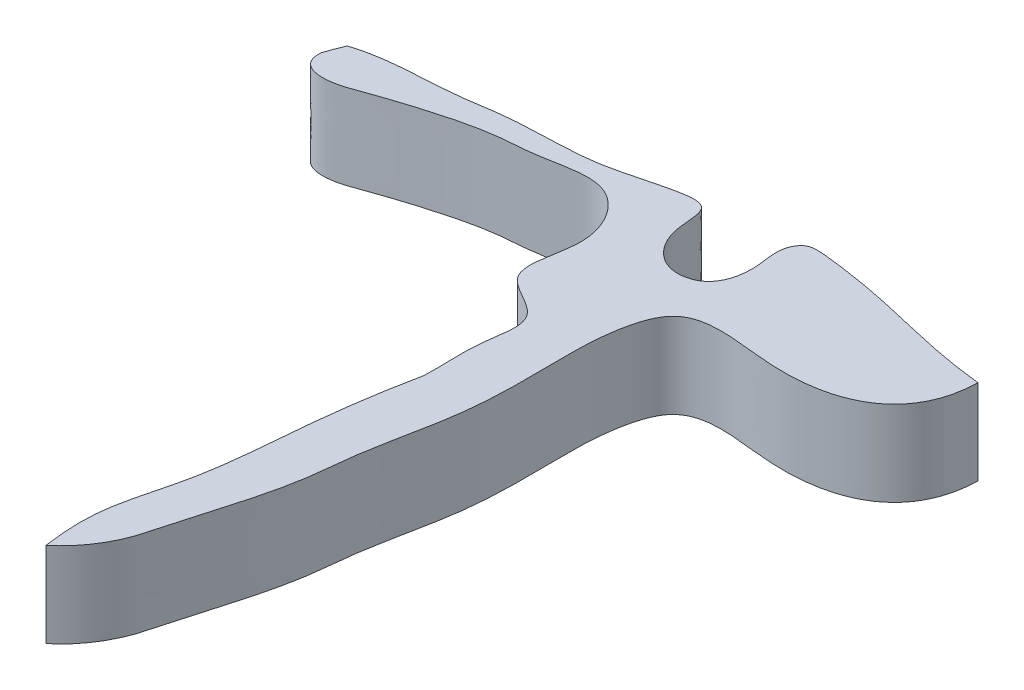
ISO-10303-21;
HEADER;
FILE_DESCRIPTION(('STEP AP214'),'2;1');
FILE_NAME('part.step','',(''),(''),'','','');
FILE_SCHEMA(('AUTOMOTIVE_DESIGN { 1 0 10303 214 1 1 1 1 }'));
ENDSEC;
DATA;
#1=APPLICATION_CONTEXT('core data for automotive mechanical design processes');
#2=APPLICATION_PROTOCOL_DEFINITION('international standard','automotive_design',2000,#1);
#3=PRODUCT_CONTEXT('',#1,'mechanical');
#4=PRODUCT('Part','Part','',(#3));
#5=PRODUCT_RELATED_PRODUCT_CATEGORY('part','',(#4));
#6=PRODUCT_DEFINITION_FORMATION('','',#4);
#7=PRODUCT_DEFINITION_CONTEXT('part definition',#1,'design');
#8=PRODUCT_DEFINITION('design','',#6,#7);
#9=PRODUCT_DEFINITION_SHAPE('','',#8);
#10=(LENGTH_UNIT() NAMED_UNIT(*) SI_UNIT(.MILLI.,.METRE.));
#11=(NAMED_UNIT(*) PLANE_ANGLE_UNIT() SI_UNIT($,.RADIAN.));
#12=(NAMED_UNIT(*) SI_UNIT($,.STERADIAN.) SOLID_ANGLE_UNIT());
#13=UNCERTAINTY_MEASURE_WITH_UNIT(LENGTH_MEASURE(1.E-05),#10,'distance_accuracy_value','');
#14=(GEOMETRIC_REPRESENTATION_CONTEXT(3) GLOBAL_UNCERTAINTY_ASSIGNED_CONTEXT((#13)) GLOBAL_UNIT_ASSIGNED_CONTEXT((#10,
#11,#12)) REPRESENTATION_CONTEXT('',''));
#15=CARTESIAN_POINT('',(0.,0.,0.));
#16=DIRECTION('',(0.,0.,1.));
#17=DIRECTION('',(1.,0.,0.));
#18=AXIS2_PLACEMENT_3D('',#15,#16,#17);
#19=CARTESIAN_POINT('',(24.0375140392618,15.,-145.517039337161));
#20=CARTESIAN_POINT('',(24.2621933412284,15.,-143.639002282934));
#21=CARTESIAN_POINT('',(25.4171269550409,15.,-138.134761259731));
#22=CARTESIAN_POINT('',(30.007706348826,15.,-128.35761833204));
#23=CARTESIAN_POINT('',(39.7991492205917,15.,-121.115164183697));
#24=CARTESIAN_POINT('',(43.2128797081711,15.,-110.146291015422));
#25=CARTESIAN_POINT('',(48.6550116352046,15.,-97.0573730260903));
#26=CARTESIAN_POINT('',(49.9672872180633,15.,-86.7279437435889));
#27=CARTESIAN_POINT('',(54.645986214799,15.,-75.4111400507352));
#28=CARTESIAN_POINT('',(57.5935042038401,15.,-57.5488206758712));
#29=CARTESIAN_POINT('',(72.3520359826397,15.,-47.8515999679621));
#30=CARTESIAN_POINT('',(69.1403617110828,15.,-35.8249751369739));
#31=CARTESIAN_POINT('',(82.723997719919,15.,-21.3135393408815));
#32=CARTESIAN_POINT('',(91.4610009765337,15.,-26.0845568898553));
#33=CARTESIAN_POINT('',(99.3599729309818,15.,-34.1459829190389));
#34=CARTESIAN_POINT('',(106.459091673804,15.,-48.0552498706429));
#35=CARTESIAN_POINT('',(101.533602131844,15.,-62.2604950775486));
#36=CARTESIAN_POINT('',(98.8404018994914,15.,-74.4775870626433));
#37=CARTESIAN_POINT('',(96.868182285158,15.,-87.5543523438555));
#38=CARTESIAN_POINT('',(101.802241124934,15.,-102.14324591199));
#39=CARTESIAN_POINT('',(102.790355638582,15.,-119.297508142271));
#40=CARTESIAN_POINT('',(104.336005258598,15.,-130.446896525842));
#41=CARTESIAN_POINT('',(105.753591562007,15.,-137.401839946369));
#42=CARTESIAN_POINT('',(105.757273732984,15.,-137.419894275042));
#43=B_SPLINE_CURVE_WITH_KNOTS('',3,(#19,#20,#21,#22,#23,#24,#25,#26,#27,#28,#29,#30,#31,#32,#33,
#34,#35,#36,#37,#38,#39,#40,#41,#42),.UNSPECIFIED.,.F.,.F.,(4,1,1,1,1,1,1,1,1,1,1,1,1,1,1,1,1,1,
1,1,1,4),(0.0848827910846383,0.107769947600504,0.154078141193935,0.187829052452645,
0.232552432956342,0.26970929217058,0.335228905495779,0.34759696703288,0.388301803040621,
0.400297277197863,0.462463604104336,0.490432200988639,0.503110695907215,0.523547211958244,
0.568461378057781,0.596541231678332,0.621395322375599,0.653634391335673,0.683152646319912,
0.723780599049945,0.766209008009937,0.766319387221955),.UNSPECIFIED.);
#44=DIRECTION('',(0.,-1.,0.));
#45=VECTOR('',#44,1.);
#46=SURFACE_OF_LINEAR_EXTRUSION('',#43,#45);
#47=CARTESIAN_POINT('',(24.0375140392618,0.,-145.517039337161));
#48=CARTESIAN_POINT('',(24.2621933412284,0.,-143.639002282934));
#49=CARTESIAN_POINT('',(25.4171269550409,0.,-138.134761259731));
#50=CARTESIAN_POINT('',(30.007706348826,0.,-128.35761833204));
#51=CARTESIAN_POINT('',(39.7991492205917,0.,-121.115164183697));
#52=CARTESIAN_POINT('',(43.2128797081711,0.,-110.146291015422));
#53=CARTESIAN_POINT('',(48.6550116352046,0.,-97.0573730260903));
#54=CARTESIAN_POINT('',(49.9672872180633,0.,-86.7279437435889));
#55=CARTESIAN_POINT('',(54.645986214799,0.,-75.4111400507352));
#56=CARTESIAN_POINT('',(57.5935042038401,0.,-57.5488206758712));
#57=CARTESIAN_POINT('',(72.3520359826397,0.,-47.8515999679621));
#58=CARTESIAN_POINT('',(69.1403617110828,0.,-35.8249751369739));
#59=CARTESIAN_POINT('',(82.723997719919,0.,-21.3135393408815));
#60=CARTESIAN_POINT('',(91.4610009765337,0.,-26.0845568898553));
#61=CARTESIAN_POINT('',(99.3599729309818,0.,-34.1459829190389));
#62=CARTESIAN_POINT('',(106.459091673804,0.,-48.0552498706429));
#63=CARTESIAN_POINT('',(101.533602131844,0.,-62.2604950775486));
#64=CARTESIAN_POINT('',(98.8404018994914,0.,-74.4775870626433));
#65=CARTESIAN_POINT('',(96.868182285158,0.,-87.5543523438555));
#66=CARTESIAN_POINT('',(101.802241124934,0.,-102.14324591199));
#67=CARTESIAN_POINT('',(102.790355638582,0.,-119.297508142271));
#68=CARTESIAN_POINT('',(104.336005258598,0.,-130.446896525842));
#69=CARTESIAN_POINT('',(105.753591562007,0.,-137.401839946369));
#70=CARTESIAN_POINT('',(105.757273732984,0.,-137.419894275042));
#71=B_SPLINE_CURVE_WITH_KNOTS('',3,(#47,#48,#49,#50,#51,#52,#53,#54,#55,#56,#57,#58,#59,#60,#61,
#62,#63,#64,#65,#66,#67,#68,#69,#70),.UNSPECIFIED.,.F.,.F.,(4,1,1,1,1,1,1,1,1,1,1,1,1,1,1,1,1,1,
1,1,1,4),(0.0848827910846383,0.107769947600504,0.154078141193935,0.187829052452645,
0.232552432956342,0.26970929217058,0.335228905495779,0.34759696703288,0.388301803040621,
0.400297277197863,0.462463604104336,0.490432200988639,0.503110695907215,0.523547211958244,
0.568461378057781,0.596541231678332,0.621395322375599,0.653634391335673,0.683152646319912,
0.723780599049945,0.766209008009937,0.766319387221955),.UNSPECIFIED.);
#72=CARTESIAN_POINT('',(98.3711739112684,0.,-78.2317084362458));
#73=VERTEX_POINT('',#72);
#74=CARTESIAN_POINT('',(105.757273732984,0.,-137.419894275042));
#75=VERTEX_POINT('',#74);
#76=EDGE_CURVE('E167',#73,#75,#71,.T.);
#77=ORIENTED_EDGE('',*,*,#76,.F.);
#78=DIRECTION('',(0.,-1.,0.));
#79=VECTOR('',#78,1.);
#80=CARTESIAN_POINT('',(98.3711739112684,15.,-78.2317084362458));
#81=LINE('',#80,#79);
#82=CARTESIAN_POINT('',(98.3711739112684,15.,-78.2317084362458));
#83=VERTEX_POINT('',#82);
#84=EDGE_CURVE('E11',#83,#73,#81,.T.);
#85=ORIENTED_EDGE('',*,*,#84,.F.);
#86=CARTESIAN_POINT('',(105.757273732984,15.,-137.419894275042));
#87=VERTEX_POINT('',#86);
#88=EDGE_CURVE('E137',#83,#87,#43,.T.);
#89=ORIENTED_EDGE('',*,*,#88,.T.);
#90=DIRECTION('',(0.,-1.,0.));
#91=VECTOR('',#90,1.);
#92=CARTESIAN_POINT('',(105.757273732984,15.,-137.419894275042));
#93=LINE('',#92,#91);
#94=EDGE_CURVE('E80',#87,#75,#93,.T.);
#95=ORIENTED_EDGE('',*,*,#94,.T.);
#96=EDGE_LOOP('',(#77,#85,#89,#95));
#97=FACE_BOUND('',#96,.T.);
#98=ADVANCED_FACE('F38',(#97),#46,.T.);
#99=CARTESIAN_POINT('',(155.713820159323,15.,-185.222032492138));
#100=CARTESIAN_POINT('',(155.425874834643,15.,-173.100712352762));
#101=CARTESIAN_POINT('',(140.483266869337,15.,-166.904105138324));
#102=CARTESIAN_POINT('',(118.936964382744,15.,-172.612470356245));
#103=CARTESIAN_POINT('',(115.192644125411,15.,-160.330308288356));
#104=CARTESIAN_POINT('',(115.348268100144,15.,-149.617652951586));
#105=CARTESIAN_POINT('',(115.444629092176,15.,-134.450964327299));
#106=CARTESIAN_POINT('',(112.04537119914,15.,-122.272000915312));
#107=CARTESIAN_POINT('',(110.825170090525,15.,-106.919954458305));
#108=CARTESIAN_POINT('',(107.256011136673,15.,-97.098479499063));
#109=CARTESIAN_POINT('',(104.287209349977,15.,-85.0571247463461));
#110=CARTESIAN_POINT('',(101.32680142316,15.,-80.6207119310641));
#111=CARTESIAN_POINT('',(98.3711739112684,15.,-78.2317084362458));
#112=B_SPLINE_CURVE_WITH_KNOTS('',3,(#99,#100,#101,#102,#103,#104,#105,#106,#107,#108,#109,#110,
#111),.UNSPECIFIED.,.F.,.F.,(4,1,1,1,1,1,1,1,1,1,4),(0.,0.208504742655187,0.326502314040696,
0.372956542354601,0.455666882521752,0.565002652878199,0.694719851294561,0.729433596082807,
0.891839378018672,0.917522652910268,1.),.UNSPECIFIED.);
#113=DIRECTION('',(0.,-1.,0.));
#114=VECTOR('',#113,1.);
#115=SURFACE_OF_LINEAR_EXTRUSION('',#112,#114);
#116=CARTESIAN_POINT('',(155.713820159323,0.,-185.222032492138));
#117=CARTESIAN_POINT('',(155.425874834643,0.,-173.100712352762));
#118=CARTESIAN_POINT('',(140.483266869337,0.,-166.904105138324));
#119=CARTESIAN_POINT('',(118.936964382744,0.,-172.612470356245));
#120=CARTESIAN_POINT('',(115.192644125411,0.,-160.330308288356));
#121=CARTESIAN_POINT('',(115.348268100144,0.,-149.617652951586));
#122=CARTESIAN_POINT('',(115.444629092176,0.,-134.450964327299));
#123=CARTESIAN_POINT('',(112.04537119914,0.,-122.272000915312));
#124=CARTESIAN_POINT('',(110.825170090525,0.,-106.919954458305));
#125=CARTESIAN_POINT('',(107.256011136673,0.,-97.098479499063));
#126=CARTESIAN_POINT('',(104.287209349977,0.,-85.0571247463461));
#127=CARTESIAN_POINT('',(101.32680142316,0.,-80.6207119310641));
#128=CARTESIAN_POINT('',(98.3711739112684,0.,-78.2317084362458));
#129=B_SPLINE_CURVE_WITH_KNOTS('',3,(#116,#117,#118,#119,#120,#121,#122,#123,#124,#125,#126,
#127,#128),.UNSPECIFIED.,.F.,.F.,(4,1,1,1,1,1,1,1,1,1,4),(0.,0.208504742655187,
0.326502314040696,0.372956542354601,0.455666882521752,0.565002652878199,0.694719851294561,
0.729433596082807,0.891839378018672,0.917522652910268,1.),.UNSPECIFIED.);
#130=CARTESIAN_POINT('',(155.713820159323,0.,-185.222032492138));
#131=VERTEX_POINT('',#130);
#132=EDGE_CURVE('E166',#131,#73,#129,.T.);
#133=ORIENTED_EDGE('',*,*,#132,.F.);
#134=DIRECTION('',(0.,-1.,0.));
#135=VECTOR('',#134,1.);
#136=CARTESIAN_POINT('',(155.713820159323,15.,-185.222032492138));
#137=LINE('',#136,#135);
#138=CARTESIAN_POINT('',(155.713820159323,15.,-185.222032492138));
#139=VERTEX_POINT('',#138);
#140=EDGE_CURVE('E47',#139,#131,#137,.T.);
#141=ORIENTED_EDGE('',*,*,#140,.F.);
#142=EDGE_CURVE('E95',#139,#83,#112,.T.);
#143=ORIENTED_EDGE('',*,*,#142,.T.);
#144=ORIENTED_EDGE('',*,*,#84,.T.);
#145=EDGE_LOOP('',(#133,#141,#143,#144));
#146=FACE_BOUND('',#145,.T.);
#147=ADVANCED_FACE('F131',(#146),#115,.T.);
#148=CARTESIAN_POINT('',(155.713820159323,15.,-185.222032492138));
#149=CARTESIAN_POINT('',(143.342435392716,15.,-186.514221571278));
#150=CARTESIAN_POINT('',(135.762881066941,15.,-190.123760484308));
#151=CARTESIAN_POINT('',(119.677410663172,15.,-191.492652460932));
#152=CARTESIAN_POINT('',(117.384240857628,15.,-188.118088909831));
#153=CARTESIAN_POINT('',(119.1020728407,15.,-183.057235226769));
#154=CARTESIAN_POINT('',(117.469060760467,15.,-176.157823140812));
#155=CARTESIAN_POINT('',(109.760824825789,15.,-174.578358031776));
#156=CARTESIAN_POINT('',(104.924855368414,15.,-180.553269248962));
#157=CARTESIAN_POINT('',(105.843805349473,15.,-189.040101481163));
#158=CARTESIAN_POINT('',(96.5318342952918,15.,-187.289596050032));
#159=CARTESIAN_POINT('',(86.9832692282938,15.,-184.161983924572));
#160=CARTESIAN_POINT('',(76.6059167192022,15.,-184.931536335817));
#161=CARTESIAN_POINT('',(62.09670727668,15.,-182.363322147543));
#162=CARTESIAN_POINT('',(54.5278983029869,15.,-182.998481509053));
#163=CARTESIAN_POINT('',(48.685902450927,15.,-181.03033137615));
#164=B_SPLINE_CURVE_WITH_KNOTS('',3,(#148,#149,#150,#151,#152,#153,#154,#155,#156,#157,#158,
#159,#160,#161,#162,#163),.UNSPECIFIED.,.F.,.F.,(4,1,1,1,1,1,1,1,1,1,1,1,1,4),(0.,
0.237104515152352,0.256899286666623,0.27101214660108,0.314512838874298,0.364494543262463,
0.396714068246079,0.458476347192645,0.498896481261305,0.536121657470359,0.613435160449401,
0.730760523837935,0.758905068892622,0.894880610996271),.UNSPECIFIED.);
#165=DIRECTION('',(0.,-1.,0.));
#166=VECTOR('',#165,1.);
#167=SURFACE_OF_LINEAR_EXTRUSION('',#164,#166);
#168=CARTESIAN_POINT('',(155.713820159323,0.,-185.222032492138));
#169=CARTESIAN_POINT('',(143.342435392716,0.,-186.514221571278));
#170=CARTESIAN_POINT('',(135.762881066941,0.,-190.123760484308));
#171=CARTESIAN_POINT('',(119.677410663172,0.,-191.492652460932));
#172=CARTESIAN_POINT('',(117.384240857628,0.,-188.118088909831));
#173=CARTESIAN_POINT('',(119.1020728407,0.,-183.057235226769));
#174=CARTESIAN_POINT('',(117.469060760467,0.,-176.157823140812));
#175=CARTESIAN_POINT('',(109.760824825789,0.,-174.578358031776));
#176=CARTESIAN_POINT('',(104.924855368414,0.,-180.553269248962));
#177=CARTESIAN_POINT('',(105.843805349473,0.,-189.040101481163));
#178=CARTESIAN_POINT('',(96.5318342952918,0.,-187.289596050032));
#179=CARTESIAN_POINT('',(86.9832692282938,0.,-184.161983924572));
#180=CARTESIAN_POINT('',(76.6059167192022,0.,-184.931536335817));
#181=CARTESIAN_POINT('',(62.09670727668,0.,-182.363322147543));
#182=CARTESIAN_POINT('',(54.5278983029869,0.,-182.998481509053));
#183=CARTESIAN_POINT('',(48.685902450927,0.,-181.03033137615));
#184=B_SPLINE_CURVE_WITH_KNOTS('',3,(#168,#169,#170,#171,#172,#173,#174,#175,#176,#177,#178,
#179,#180,#181,#182,#183),.UNSPECIFIED.,.F.,.F.,(4,1,1,1,1,1,1,1,1,1,1,1,1,4),(0.,
0.237104515152352,0.256899286666623,0.27101214660108,0.314512838874298,0.364494543262463,
0.396714068246079,0.458476347192645,0.498896481261305,0.536121657470359,0.613435160449401,
0.730760523837935,0.758905068892622,0.894880610996271),.UNSPECIFIED.);
#185=CARTESIAN_POINT('',(48.685902450927,0.,-181.03033137615));
#186=VERTEX_POINT('',#185);
#187=EDGE_CURVE('E102',#131,#186,#184,.T.);
#188=ORIENTED_EDGE('',*,*,#187,.T.);
#189=DIRECTION('',(0.,-1.,0.));
#190=VECTOR('',#189,1.);
#191=CARTESIAN_POINT('',(48.685902450927,15.,-181.03033137615));
#192=LINE('',#191,#190);
#193=CARTESIAN_POINT('',(48.685902450927,15.,-181.03033137615));
#194=VERTEX_POINT('',#193);
#195=EDGE_CURVE('E99',#194,#186,#192,.T.);
#196=ORIENTED_EDGE('',*,*,#195,.F.);
#197=EDGE_CURVE('E89',#139,#194,#164,.T.);
#198=ORIENTED_EDGE('',*,*,#197,.F.);
#199=ORIENTED_EDGE('',*,*,#140,.T.);
#200=EDGE_LOOP('',(#188,#196,#198,#199));
#201=FACE_BOUND('',#200,.T.);
#202=ADVANCED_FACE('F100',(#201),#167,.F.);
#203=CARTESIAN_POINT('',(46.5719716406135,15.,-170.254393226502));
#204=CARTESIAN_POINT('',(45.9125632375146,15.,-174.769031776489));
#205=CARTESIAN_POINT('',(48.685902450927,15.,-181.03033137615));
#206=B_SPLINE_CURVE_WITH_KNOTS('',2,(#203,#204,#205),.UNSPECIFIED.,.F.,.F.,(3,3),
(0.88449036683675,1.),.UNSPECIFIED.);
#207=DIRECTION('',(0.,-1.,0.));
#208=VECTOR('',#207,1.);
#209=SURFACE_OF_LINEAR_EXTRUSION('',#206,#208);
#210=CARTESIAN_POINT('',(46.5719716406135,0.,-170.254393226502));
#211=CARTESIAN_POINT('',(45.9125632375146,0.,-174.769031776489));
#212=CARTESIAN_POINT('',(48.685902450927,0.,-181.03033137615));
#213=B_SPLINE_CURVE_WITH_KNOTS('',2,(#210,#211,#212),.UNSPECIFIED.,.F.,.F.,(3,3),
(0.88449036683675,1.),.UNSPECIFIED.);
#214=CARTESIAN_POINT('',(47.4203754723442,0.,-177.719365278845));
#215=VERTEX_POINT('',#214);
#216=EDGE_CURVE('E148',#215,#186,#213,.T.);
#217=ORIENTED_EDGE('',*,*,#216,.F.);
#218=DIRECTION('',(0.,-1.,0.));
#219=VECTOR('',#218,1.);
#220=CARTESIAN_POINT('',(47.4203754723442,15.,-177.719365278845));
#221=LINE('',#220,#219);
#222=CARTESIAN_POINT('',(47.4203754723442,15.,-177.719365278845));
#223=VERTEX_POINT('',#222);
#224=EDGE_CURVE('E73',#223,#215,#221,.T.);
#225=ORIENTED_EDGE('',*,*,#224,.F.);
#226=EDGE_CURVE('E93',#223,#194,#206,.T.);
#227=ORIENTED_EDGE('',*,*,#226,.T.);
#228=ORIENTED_EDGE('',*,*,#195,.T.);
#229=EDGE_LOOP('',(#217,#225,#227,#228));
#230=FACE_BOUND('',#229,.T.);
#231=ADVANCED_FACE('F107',(#230),#209,.T.);
#232=CARTESIAN_POINT('',(47.445167588498,15.,-177.95175500958));
#233=CARTESIAN_POINT('',(47.0253510892153,15.,-174.602758943711));
#234=CARTESIAN_POINT('',(51.7592821933048,15.,-173.341203921857));
#235=CARTESIAN_POINT('',(58.5168000033298,15.,-175.988264579083));
#236=CARTESIAN_POINT('',(66.5294025055738,15.,-178.560886227428));
#237=CARTESIAN_POINT('',(74.6758893928582,15.,-180.591612459629));
#238=CARTESIAN_POINT('',(83.638862203363,15.,-180.930288074213));
#239=CARTESIAN_POINT('',(93.9024394394277,15.,-184.369053507246));
#240=CARTESIAN_POINT('',(101.590112285161,15.,-172.298935736747));
#241=CARTESIAN_POINT('',(95.3587693979354,15.,-160.020471882483));
#242=CARTESIAN_POINT('',(107.883313290671,15.,-156.836055830425));
#243=CARTESIAN_POINT('',(105.171638752526,15.,-146.495919028148));
#244=CARTESIAN_POINT('',(105.945825945678,15.,-141.078138073815));
#245=CARTESIAN_POINT('',(105.757273732984,15.,-137.419894275042));
#246=B_SPLINE_CURVE_WITH_KNOTS('',3,(#232,#233,#234,#235,#236,#237,#238,#239,#240,#241,#242,
#243,#244,#245),.UNSPECIFIED.,.F.,.F.,(4,1,1,1,1,1,1,1,1,1,1,4),(0.,0.0680498849040532,
0.126734754825669,0.221277447388333,0.325872866551354,0.379657996372761,0.499723596851406,
0.610693351389872,0.730784057264137,0.814836596301791,0.893690288383797,1.),.UNSPECIFIED.);
#247=DIRECTION('',(0.,-1.,0.));
#248=VECTOR('',#247,1.);
#249=SURFACE_OF_LINEAR_EXTRUSION('',#246,#248);
#250=CARTESIAN_POINT('',(47.445167588498,0.,-177.95175500958));
#251=CARTESIAN_POINT('',(47.0253510892153,0.,-174.602758943711));
#252=CARTESIAN_POINT('',(51.7592821933048,0.,-173.341203921857));
#253=CARTESIAN_POINT('',(58.5168000033298,0.,-175.988264579083));
#254=CARTESIAN_POINT('',(66.5294025055738,0.,-178.560886227428));
#255=CARTESIAN_POINT('',(74.6758893928582,0.,-180.591612459629));
#256=CARTESIAN_POINT('',(83.638862203363,0.,-180.930288074213));
#257=CARTESIAN_POINT('',(93.9024394394277,0.,-184.369053507246));
#258=CARTESIAN_POINT('',(101.590112285161,0.,-172.298935736747));
#259=CARTESIAN_POINT('',(95.3587693979354,0.,-160.020471882483));
#260=CARTESIAN_POINT('',(107.883313290671,0.,-156.836055830425));
#261=CARTESIAN_POINT('',(105.171638752526,0.,-146.495919028148));
#262=CARTESIAN_POINT('',(105.945825945678,0.,-141.078138073815));
#263=CARTESIAN_POINT('',(105.757273732984,0.,-137.419894275042));
#264=B_SPLINE_CURVE_WITH_KNOTS('',3,(#250,#251,#252,#253,#254,#255,#256,#257,#258,#259,#260,
#261,#262,#263),.UNSPECIFIED.,.F.,.F.,(4,1,1,1,1,1,1,1,1,1,1,4),(0.,0.0680498849040532,
0.126734754825669,0.221277447388333,0.325872866551354,0.379657996372761,0.499723596851406,
0.610693351389872,0.730784057264137,0.814836596301791,0.893690288383797,1.),.UNSPECIFIED.);
#265=EDGE_CURVE('E144',#215,#75,#264,.T.);
#266=ORIENTED_EDGE('',*,*,#265,.T.);
#267=ORIENTED_EDGE('',*,*,#94,.F.);
#268=EDGE_CURVE('E55',#223,#87,#246,.T.);
#269=ORIENTED_EDGE('',*,*,#268,.F.);
#270=ORIENTED_EDGE('',*,*,#224,.T.);
#271=EDGE_LOOP('',(#266,#267,#269,#270));
#272=FACE_BOUND('',#271,.T.);
#273=ADVANCED_FACE('F128',(#272),#249,.F.);
#274=CARTESIAN_POINT('',(0.,15.,0.));
#275=DIRECTION('',(0.,1.,0.));
#276=DIRECTION('',(0.,0.,1.));
#277=AXIS2_PLACEMENT_3D('',#274,#275,#276);
#278=PLANE('',#277);
#279=ORIENTED_EDGE('',*,*,#88,.F.);
#280=ORIENTED_EDGE('',*,*,#142,.F.);
#281=ORIENTED_EDGE('',*,*,#197,.T.);
#282=ORIENTED_EDGE('',*,*,#226,.F.);
#283=ORIENTED_EDGE('',*,*,#268,.T.);
#284=EDGE_LOOP('',(#279,#280,#281,#282,#283));
#285=FACE_BOUND('',#284,.T.);
#286=ADVANCED_FACE('F91',(#285),#278,.T.);
#287=CARTESIAN_POINT('',(0.,0.,0.));
#288=DIRECTION('',(0.,1.,0.));
#289=DIRECTION('',(0.,0.,1.));
#290=AXIS2_PLACEMENT_3D('',#287,#288,#289);
#291=PLANE('',#290);
#292=ORIENTED_EDGE('',*,*,#76,.T.);
#293=ORIENTED_EDGE('',*,*,#265,.F.);
#294=ORIENTED_EDGE('',*,*,#216,.T.);
#295=ORIENTED_EDGE('',*,*,#187,.F.);
#296=ORIENTED_EDGE('',*,*,#132,.T.);
#297=EDGE_LOOP('',(#292,#293,#294,#295,#296));
#298=FACE_BOUND('',#297,.T.);
#299=ADVANCED_FACE('F165',(#298),#291,.F.);
#300=CLOSED_SHELL('',(#98,#147,#202,#231,#273,#286,#299));
#301=MANIFOLD_SOLID_BREP('B2',#300);
#302=ADVANCED_BREP_SHAPE_REPRESENTATION('',(#18,#301),#14);
#303=SHAPE_DEFINITION_REPRESENTATION(#9,#302);
ENDSEC;
END-ISO-10303-21;
